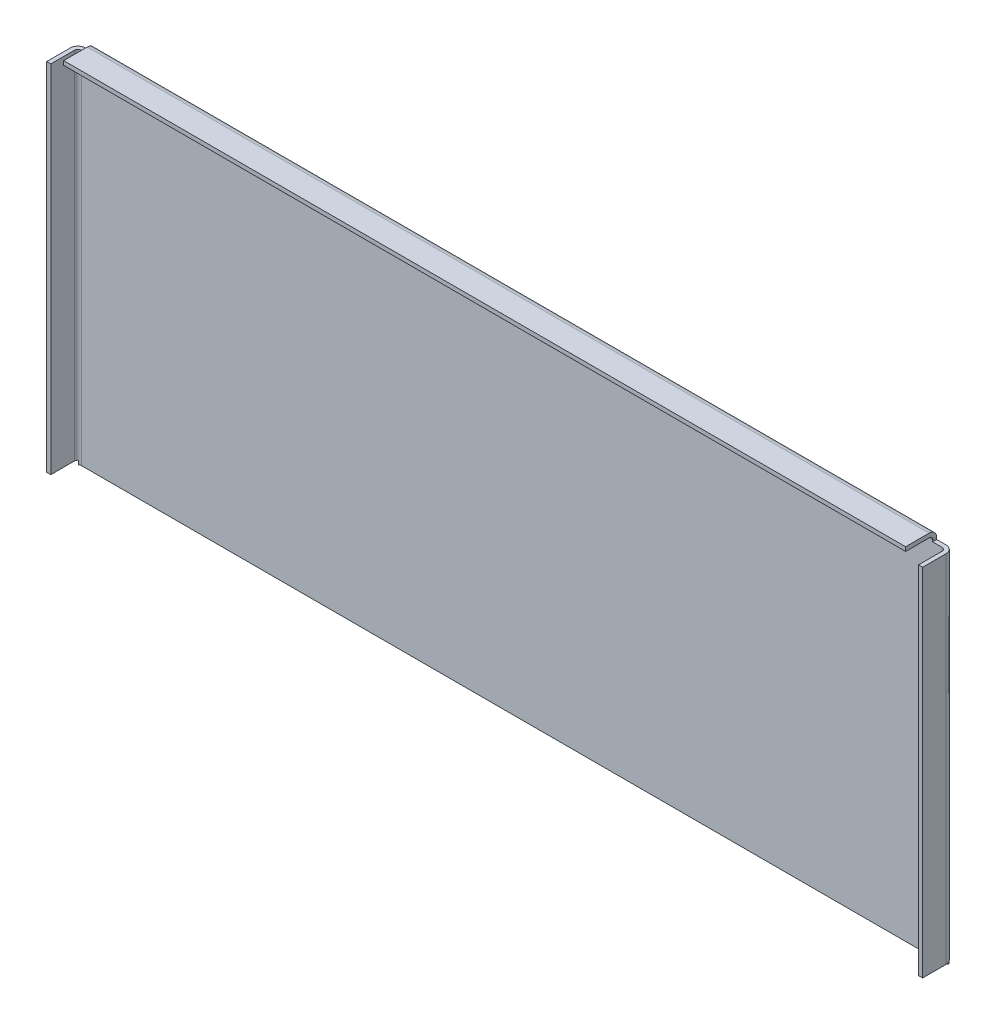
ISO-10303-21;
HEADER;
FILE_DESCRIPTION(('STEP AP214'),'2;1');
FILE_NAME('part.step','',(''),(''),'','','');
FILE_SCHEMA(('AUTOMOTIVE_DESIGN { 1 0 10303 214 1 1 1 1 }'));
ENDSEC;
DATA;
#1=APPLICATION_CONTEXT('core data for automotive mechanical design processes');
#2=APPLICATION_PROTOCOL_DEFINITION('international standard','automotive_design',2000,#1);
#3=PRODUCT_CONTEXT('',#1,'mechanical');
#4=PRODUCT('Part','Part','',(#3));
#5=PRODUCT_RELATED_PRODUCT_CATEGORY('part','',(#4));
#6=PRODUCT_DEFINITION_FORMATION('','',#4);
#7=PRODUCT_DEFINITION_CONTEXT('part definition',#1,'design');
#8=PRODUCT_DEFINITION('design','',#6,#7);
#9=PRODUCT_DEFINITION_SHAPE('','',#8);
#10=(LENGTH_UNIT() NAMED_UNIT(*) SI_UNIT(.MILLI.,.METRE.));
#11=(NAMED_UNIT(*) PLANE_ANGLE_UNIT() SI_UNIT($,.RADIAN.));
#12=(NAMED_UNIT(*) SI_UNIT($,.STERADIAN.) SOLID_ANGLE_UNIT());
#13=UNCERTAINTY_MEASURE_WITH_UNIT(LENGTH_MEASURE(1.E-05),#10,'distance_accuracy_value','');
#14=(GEOMETRIC_REPRESENTATION_CONTEXT(3) GLOBAL_UNCERTAINTY_ASSIGNED_CONTEXT((#13)) GLOBAL_UNIT_ASSIGNED_CONTEXT((#10,
#11,#12)) REPRESENTATION_CONTEXT('',''));
#15=CARTESIAN_POINT('',(0.,0.,0.));
#16=DIRECTION('',(0.,0.,1.));
#17=DIRECTION('',(1.,0.,0.));
#18=AXIS2_PLACEMENT_3D('',#15,#16,#17);
#19=CARTESIAN_POINT('',(-201.320399999998,0.,-197.706530426023));
#20=DIRECTION('',(1.,0.,0.));
#21=DIRECTION('',(0.,0.,-1.));
#22=AXIS2_PLACEMENT_3D('',#19,#20,#21);
#23=PLANE('',#22);
#24=DIRECTION('',(0.,1.,0.));
#25=VECTOR('',#24,1.);
#26=CARTESIAN_POINT('',(-201.3204,81.46415,14.2875));
#27=LINE('',#26,#25);
#28=CARTESIAN_POINT('',(-201.3204,81.46415,14.2875));
#29=VERTEX_POINT('',#28);
#30=CARTESIAN_POINT('',(-201.3204,-82.0674,14.2875));
#31=VERTEX_POINT('',#30);
#32=EDGE_CURVE('E159',#29,#31,#27,.F.);
#33=ORIENTED_EDGE('',*,*,#32,.F.);
#34=DIRECTION('',(0.,0.,1.));
#35=VECTOR('',#34,1.);
#36=CARTESIAN_POINT('',(-201.3204,81.46415,3.46709999999997));
#37=LINE('',#36,#35);
#38=CARTESIAN_POINT('',(-201.320399999999,81.46415,3.46710000000001));
#39=VERTEX_POINT('',#38);
#40=EDGE_CURVE('E256',#39,#29,#37,.T.);
#41=ORIENTED_EDGE('',*,*,#40,.F.);
#42=DIRECTION('',(0.,1.,0.));
#43=VECTOR('',#42,1.);
#44=CARTESIAN_POINT('',(-201.320399999997,-1.190625,3.46710000000002));
#45=LINE('',#44,#43);
#46=CARTESIAN_POINT('',(-201.320399999999,-82.0674,3.46710000000001));
#47=VERTEX_POINT('',#46);
#48=EDGE_CURVE('E252',#47,#39,#45,.T.);
#49=ORIENTED_EDGE('',*,*,#48,.F.);
#50=DIRECTION('',(0.,0.,1.));
#51=VECTOR('',#50,1.);
#52=CARTESIAN_POINT('',(-201.3204,-82.0674,1.58750000000001));
#53=LINE('',#52,#51);
#54=EDGE_CURVE('E275',#47,#31,#53,.T.);
#55=ORIENTED_EDGE('',*,*,#54,.T.);
#56=EDGE_LOOP('',(#33,#41,#49,#55));
#57=FACE_BOUND('',#56,.T.);
#58=ADVANCED_FACE('F17',(#57),#23,.F.);
#59=CARTESIAN_POINT('',(201.320399999998,0.,-197.706530426023));
#60=DIRECTION('',(-1.,0.,0.));
#61=DIRECTION('',(0.,0.,1.));
#62=AXIS2_PLACEMENT_3D('',#59,#60,#61);
#63=PLANE('',#62);
#64=DIRECTION('',(0.,-1.,0.));
#65=VECTOR('',#64,1.);
#66=CARTESIAN_POINT('',(201.320399999997,-1.190625,3.46710000000003));
#67=LINE('',#66,#65);
#68=CARTESIAN_POINT('',(201.320399999999,81.46415,3.46710000000003));
#69=VERTEX_POINT('',#68);
#70=CARTESIAN_POINT('',(201.320399999999,-82.0674,3.46710000000003));
#71=VERTEX_POINT('',#70);
#72=EDGE_CURVE('E347',#69,#71,#67,.T.);
#73=ORIENTED_EDGE('',*,*,#72,.F.);
#74=DIRECTION('',(0.,0.,1.));
#75=VECTOR('',#74,1.);
#76=CARTESIAN_POINT('',(201.3204,81.46415,3.46710000000005));
#77=LINE('',#76,#75);
#78=CARTESIAN_POINT('',(201.3204,81.46415,14.2875000000001));
#79=VERTEX_POINT('',#78);
#80=EDGE_CURVE('E376',#79,#69,#77,.F.);
#81=ORIENTED_EDGE('',*,*,#80,.F.);
#82=DIRECTION('',(0.,1.,0.));
#83=VECTOR('',#82,1.);
#84=CARTESIAN_POINT('',(201.3204,-83.8454,14.2875000000001));
#85=LINE('',#84,#83);
#86=CARTESIAN_POINT('',(201.3204,-82.0674,14.2875));
#87=VERTEX_POINT('',#86);
#88=EDGE_CURVE('E217',#87,#79,#85,.T.);
#89=ORIENTED_EDGE('',*,*,#88,.F.);
#90=DIRECTION('',(0.,0.,1.));
#91=VECTOR('',#90,1.);
#92=CARTESIAN_POINT('',(201.3204,-82.0674,14.2875));
#93=LINE('',#92,#91);
#94=EDGE_CURVE('E214',#87,#71,#93,.F.);
#95=ORIENTED_EDGE('',*,*,#94,.T.);
#96=EDGE_LOOP('',(#73,#81,#89,#95));
#97=FACE_BOUND('',#96,.T.);
#98=ADVANCED_FACE('F623',(#97),#63,.F.);
#99=CARTESIAN_POINT('',(0.,85.725,-82.1111304260231));
#100=DIRECTION('',(0.,-1.,0.));
#101=DIRECTION('',(0.,0.,-1.));
#102=AXIS2_PLACEMENT_3D('',#99,#100,#101);
#103=PLANE('',#102);
#104=DIRECTION('',(0.,0.,1.));
#105=VECTOR('',#104,1.);
#106=CARTESIAN_POINT('',(-193.52387,85.7249999999997,3.46709999999997));
#107=LINE('',#106,#105);
#108=CARTESIAN_POINT('',(-193.52387,85.7249999999998,14.2875));
#109=VERTEX_POINT('',#108);
#110=CARTESIAN_POINT('',(-193.52387,85.7249999999998,3.46709999999999));
#111=VERTEX_POINT('',#110);
#112=EDGE_CURVE('E288',#109,#111,#107,.F.);
#113=ORIENTED_EDGE('',*,*,#112,.F.);
#114=DIRECTION('',(1.,0.,0.));
#115=VECTOR('',#114,1.);
#116=CARTESIAN_POINT('',(193.52387,85.725,14.2875));
#117=LINE('',#116,#115);
#118=CARTESIAN_POINT('',(193.52387,85.725,14.2875));
#119=VERTEX_POINT('',#118);
#120=EDGE_CURVE('E185',#119,#109,#117,.F.);
#121=ORIENTED_EDGE('',*,*,#120,.F.);
#122=DIRECTION('',(0.,0.,1.));
#123=VECTOR('',#122,1.);
#124=CARTESIAN_POINT('',(193.52387,85.725,3.4671));
#125=LINE('',#124,#123);
#126=CARTESIAN_POINT('',(193.52387,85.725,3.4671));
#127=VERTEX_POINT('',#126);
#128=EDGE_CURVE('E294',#127,#119,#125,.T.);
#129=ORIENTED_EDGE('',*,*,#128,.F.);
#130=DIRECTION('',(1.,0.,0.));
#131=VECTOR('',#130,1.);
#132=CARTESIAN_POINT('',(0.,85.725,3.4671));
#133=LINE('',#132,#131);
#134=EDGE_CURVE('E498',#111,#127,#133,.T.);
#135=ORIENTED_EDGE('',*,*,#134,.F.);
#136=EDGE_LOOP('',(#113,#121,#129,#135));
#137=FACE_BOUND('',#136,.T.);
#138=ADVANCED_FACE('F620',(#137),#103,.F.);
#139=CARTESIAN_POINT('',(-193.52895,82.25282,1.8796));
#140=DIRECTION('',(0.,-1.,0.));
#141=DIRECTION('',(0.,0.,-1.));
#142=AXIS2_PLACEMENT_3D('',#139,#140,#141);
#143=PLANE('',#142);
#144=DIRECTION('',(0.,0.,-1.));
#145=VECTOR('',#144,1.);
#146=CARTESIAN_POINT('',(-193.52895,82.25282,0.));
#147=LINE('',#146,#145);
#148=CARTESIAN_POINT('',(-193.52895,82.25282,0.));
#149=VERTEX_POINT('',#148);
#150=CARTESIAN_POINT('',(-193.52895,82.25282,1.8796));
#151=VERTEX_POINT('',#150);
#152=EDGE_CURVE('E287',#149,#151,#147,.F.);
#153=ORIENTED_EDGE('',*,*,#152,.T.);
#154=DIRECTION('',(1.,0.,0.));
#155=VECTOR('',#154,1.);
#156=CARTESIAN_POINT('',(-193.52895,82.25282,1.8796));
#157=LINE('',#156,#155);
#158=CARTESIAN_POINT('',(-193.52387,82.25282,1.8796));
#159=VERTEX_POINT('',#158);
#160=EDGE_CURVE('E176',#159,#151,#157,.F.);
#161=ORIENTED_EDGE('',*,*,#160,.F.);
#162=DIRECTION('',(0.,0.,-1.));
#163=VECTOR('',#162,1.);
#164=CARTESIAN_POINT('',(-193.52387,82.25282,1.8796));
#165=LINE('',#164,#163);
#166=CARTESIAN_POINT('',(-193.52387,82.25282,0.));
#167=VERTEX_POINT('',#166);
#168=EDGE_CURVE('E405',#159,#167,#165,.T.);
#169=ORIENTED_EDGE('',*,*,#168,.T.);
#170=DIRECTION('',(1.,0.,0.));
#171=VECTOR('',#170,1.);
#172=CARTESIAN_POINT('',(-193.52895,82.25282,0.));
#173=LINE('',#172,#171);
#174=EDGE_CURVE('E278',#149,#167,#173,.T.);
#175=ORIENTED_EDGE('',*,*,#174,.F.);
#176=EDGE_LOOP('',(#153,#161,#169,#175));
#177=FACE_BOUND('',#176,.T.);
#178=ADVANCED_FACE('F622',(#177),#143,.F.);
#179=CARTESIAN_POINT('',(-199.4408,81.46415,14.2875));
#180=DIRECTION('',(0.,0.,1.));
#181=DIRECTION('',(1.,0.,0.));
#182=AXIS2_PLACEMENT_3D('',#179,#180,#181);
#183=PLANE('',#182);
#184=DIRECTION('',(1.,0.,0.));
#185=VECTOR('',#184,1.);
#186=CARTESIAN_POINT('',(-199.4408,81.46415,14.2875));
#187=LINE('',#186,#185);
#188=CARTESIAN_POINT('',(-199.4408,81.46415,14.2875));
#189=VERTEX_POINT('',#188);
#190=EDGE_CURVE('E259',#29,#189,#187,.T.);
#191=ORIENTED_EDGE('',*,*,#190,.F.);
#192=ORIENTED_EDGE('',*,*,#32,.T.);
#193=DIRECTION('',(1.,0.,0.));
#194=VECTOR('',#193,1.);
#195=CARTESIAN_POINT('',(-199.4408,-82.0674,14.2875));
#196=LINE('',#195,#194);
#197=CARTESIAN_POINT('',(-199.4408,-82.0674,14.2875));
#198=VERTEX_POINT('',#197);
#199=EDGE_CURVE('E272',#31,#198,#196,.T.);
#200=ORIENTED_EDGE('',*,*,#199,.T.);
#201=DIRECTION('',(0.,1.,0.));
#202=VECTOR('',#201,1.);
#203=CARTESIAN_POINT('',(-199.4408,0.,14.2875));
#204=LINE('',#203,#202);
#205=EDGE_CURVE('E266',#189,#198,#204,.F.);
#206=ORIENTED_EDGE('',*,*,#205,.F.);
#207=EDGE_LOOP('',(#191,#192,#200,#206));
#208=FACE_BOUND('',#207,.T.);
#209=ADVANCED_FACE('F629',(#208),#183,.T.);
#210=CARTESIAN_POINT('',(-201.3204,-82.0674,3.46710000000003));
#211=DIRECTION('',(0.,1.,0.));
#212=DIRECTION('',(0.,0.,1.));
#213=AXIS2_PLACEMENT_3D('',#210,#211,#212);
#214=PLANE('',#213);
#215=CARTESIAN_POINT('',(-197.8533,-82.0674,3.4671));
#216=DIRECTION('',(0.,1.,0.));
#217=DIRECTION('',(0.,0.,1.));
#218=AXIS2_PLACEMENT_3D('',#215,#216,#217);
#219=CIRCLE('',#218,3.46709999999733);
#220=CARTESIAN_POINT('',(-200.037663980923,-82.0674,0.774640825038136));
#221=VERTEX_POINT('',#220);
#222=EDGE_CURVE('E255',#221,#47,#219,.T.);
#223=ORIENTED_EDGE('',*,*,#222,.F.);
#224=DIRECTION('',(-0.630026241217164,0.,-0.776573844124158));
#225=VECTOR('',#224,1.);
#226=CARTESIAN_POINT('',(-200.037663980924,-82.0674,0.774640825037131));
#227=LINE('',#226,#225);
#228=CARTESIAN_POINT('',(-198.853466657931,-82.0674,2.23428902245493));
#229=VERTEX_POINT('',#228);
#230=EDGE_CURVE('E248',#221,#229,#227,.F.);
#231=ORIENTED_EDGE('',*,*,#230,.T.);
#232=CARTESIAN_POINT('',(-197.8533,-82.0674,3.4671));
#233=DIRECTION('',(0.,1.,0.));
#234=DIRECTION('',(0.,0.,1.));
#235=AXIS2_PLACEMENT_3D('',#232,#233,#234);
#236=CIRCLE('',#235,1.58749999999732);
#237=CARTESIAN_POINT('',(-199.440799999999,-82.0674,3.4671));
#238=VERTEX_POINT('',#237);
#239=EDGE_CURVE('E20',#238,#229,#236,.F.);
#240=ORIENTED_EDGE('',*,*,#239,.F.);
#241=DIRECTION('',(0.,0.,-1.));
#242=VECTOR('',#241,1.);
#243=CARTESIAN_POINT('',(-199.440799999998,-82.0674,-197.706530426023));
#244=LINE('',#243,#242);
#245=EDGE_CURVE('E393',#198,#238,#244,.T.);
#246=ORIENTED_EDGE('',*,*,#245,.F.);
#247=ORIENTED_EDGE('',*,*,#199,.F.);
#248=ORIENTED_EDGE('',*,*,#54,.F.);
#249=EDGE_LOOP('',(#223,#231,#240,#246,#247,#248));
#250=FACE_BOUND('',#249,.T.);
#251=ADVANCED_FACE('F636',(#250),#214,.F.);
#252=CARTESIAN_POINT('',(199.4408,-83.8454,14.2875));
#253=DIRECTION('',(0.,0.,1.));
#254=DIRECTION('',(1.,0.,0.));
#255=AXIS2_PLACEMENT_3D('',#252,#253,#254);
#256=PLANE('',#255);
#257=DIRECTION('',(1.,0.,0.));
#258=VECTOR('',#257,1.);
#259=CARTESIAN_POINT('',(199.4408,81.46415,14.2875));
#260=LINE('',#259,#258);
#261=CARTESIAN_POINT('',(199.4408,81.46415,14.2875));
#262=VERTEX_POINT('',#261);
#263=EDGE_CURVE('E223',#262,#79,#260,.T.);
#264=ORIENTED_EDGE('',*,*,#263,.F.);
#265=DIRECTION('',(0.,1.,0.));
#266=VECTOR('',#265,1.);
#267=CARTESIAN_POINT('',(199.4408,0.,14.2875));
#268=LINE('',#267,#266);
#269=CARTESIAN_POINT('',(199.4408,-82.0674,14.2875));
#270=VERTEX_POINT('',#269);
#271=EDGE_CURVE('E220',#270,#262,#268,.T.);
#272=ORIENTED_EDGE('',*,*,#271,.F.);
#273=DIRECTION('',(1.,0.,0.));
#274=VECTOR('',#273,1.);
#275=CARTESIAN_POINT('',(199.4408,-82.0674,14.2875));
#276=LINE('',#275,#274);
#277=EDGE_CURVE('E208',#270,#87,#276,.T.);
#278=ORIENTED_EDGE('',*,*,#277,.T.);
#279=ORIENTED_EDGE('',*,*,#88,.T.);
#280=EDGE_LOOP('',(#264,#272,#278,#279));
#281=FACE_BOUND('',#280,.T.);
#282=ADVANCED_FACE('F221',(#281),#256,.T.);
#283=CARTESIAN_POINT('',(199.4408,-82.0674,3.46710000000003));
#284=DIRECTION('',(0.,1.,0.));
#285=DIRECTION('',(0.,0.,1.));
#286=AXIS2_PLACEMENT_3D('',#283,#284,#285);
#287=PLANE('',#286);
#288=CARTESIAN_POINT('',(197.8533,-82.0674,3.4671));
#289=DIRECTION('',(0.,-1.,0.));
#290=DIRECTION('',(0.,0.,-1.));
#291=AXIS2_PLACEMENT_3D('',#288,#289,#290);
#292=CIRCLE('',#291,1.58749999999732);
#293=CARTESIAN_POINT('',(198.853466657931,-82.0674,2.23428902245493));
#294=VERTEX_POINT('',#293);
#295=CARTESIAN_POINT('',(199.440799999999,-82.0674,3.46710000000002));
#296=VERTEX_POINT('',#295);
#297=EDGE_CURVE('E299',#294,#296,#292,.T.);
#298=ORIENTED_EDGE('',*,*,#297,.F.);
#299=DIRECTION('',(-0.630026241217164,0.,0.776573844124158));
#300=VECTOR('',#299,1.);
#301=CARTESIAN_POINT('',(200.037663980924,-82.0674,0.774640825037131));
#302=LINE('',#301,#300);
#303=CARTESIAN_POINT('',(200.037663980923,-82.0674,0.774640825038136));
#304=VERTEX_POINT('',#303);
#305=EDGE_CURVE('E362',#294,#304,#302,.F.);
#306=ORIENTED_EDGE('',*,*,#305,.T.);
#307=CARTESIAN_POINT('',(197.8533,-82.0674,3.4671));
#308=DIRECTION('',(0.,-1.,0.));
#309=DIRECTION('',(0.,0.,-1.));
#310=AXIS2_PLACEMENT_3D('',#307,#308,#309);
#311=CIRCLE('',#310,3.46709999999733);
#312=EDGE_CURVE('E343',#71,#304,#311,.F.);
#313=ORIENTED_EDGE('',*,*,#312,.F.);
#314=ORIENTED_EDGE('',*,*,#94,.F.);
#315=ORIENTED_EDGE('',*,*,#277,.F.);
#316=DIRECTION('',(0.,0.,1.));
#317=VECTOR('',#316,1.);
#318=CARTESIAN_POINT('',(199.440799999998,-82.0674,-197.706530426023));
#319=LINE('',#318,#317);
#320=EDGE_CURVE('E212',#296,#270,#319,.T.);
#321=ORIENTED_EDGE('',*,*,#320,.F.);
#322=EDGE_LOOP('',(#298,#306,#313,#314,#315,#321));
#323=FACE_BOUND('',#322,.T.);
#324=ADVANCED_FACE('F210',(#323),#287,.F.);
#325=CARTESIAN_POINT('',(193.52387,82.25282,1.8796));
#326=DIRECTION('',(0.,-1.,0.));
#327=DIRECTION('',(0.,0.,-1.));
#328=AXIS2_PLACEMENT_3D('',#325,#326,#327);
#329=PLANE('',#328);
#330=DIRECTION('',(0.,0.,1.));
#331=VECTOR('',#330,1.);
#332=CARTESIAN_POINT('',(193.52387,82.25282,1.8796));
#333=LINE('',#332,#331);
#334=CARTESIAN_POINT('',(193.52387,82.25282,0.));
#335=VERTEX_POINT('',#334);
#336=CARTESIAN_POINT('',(193.52387,82.25282,1.8796));
#337=VERTEX_POINT('',#336);
#338=EDGE_CURVE('E346',#335,#337,#333,.T.);
#339=ORIENTED_EDGE('',*,*,#338,.T.);
#340=DIRECTION('',(1.,0.,0.));
#341=VECTOR('',#340,1.);
#342=CARTESIAN_POINT('',(193.52387,82.25282,1.8796));
#343=LINE('',#342,#341);
#344=CARTESIAN_POINT('',(193.52895,82.25282,1.8796));
#345=VERTEX_POINT('',#344);
#346=EDGE_CURVE('E350',#345,#337,#343,.F.);
#347=ORIENTED_EDGE('',*,*,#346,.F.);
#348=DIRECTION('',(0.,0.,1.));
#349=VECTOR('',#348,1.);
#350=CARTESIAN_POINT('',(193.52895,82.25282,0.));
#351=LINE('',#350,#349);
#352=CARTESIAN_POINT('',(193.52895,82.25282,0.));
#353=VERTEX_POINT('',#352);
#354=EDGE_CURVE('E418',#345,#353,#351,.F.);
#355=ORIENTED_EDGE('',*,*,#354,.T.);
#356=DIRECTION('',(1.,0.,0.));
#357=VECTOR('',#356,1.);
#358=CARTESIAN_POINT('',(193.52387,82.25282,0.));
#359=LINE('',#358,#357);
#360=EDGE_CURVE('E349',#335,#353,#359,.T.);
#361=ORIENTED_EDGE('',*,*,#360,.F.);
#362=EDGE_LOOP('',(#339,#347,#355,#361));
#363=FACE_BOUND('',#362,.T.);
#364=ADVANCED_FACE('F645',(#363),#329,.F.);
#365=CARTESIAN_POINT('',(-197.8533,-1.190625,3.4671));
#366=DIRECTION('',(0.,1.,0.));
#367=DIRECTION('',(0.,0.,1.));
#368=AXIS2_PLACEMENT_3D('',#365,#366,#367);
#369=CYLINDRICAL_SURFACE('',#368,3.46709999999733);
#370=DIRECTION('',(0.,1.,0.));
#371=VECTOR('',#370,1.);
#372=CARTESIAN_POINT('',(-197.8533,0.,0.));
#373=LINE('',#372,#371);
#374=CARTESIAN_POINT('',(-197.8533,81.46415,1.33356867215717E-12));
#375=VERTEX_POINT('',#374);
#376=CARTESIAN_POINT('',(-197.8533,-83.8454,1.33315233852294E-12));
#377=VERTEX_POINT('',#376);
#378=EDGE_CURVE('E421',#375,#377,#373,.F.);
#379=ORIENTED_EDGE('',*,*,#378,.T.);
#380=CARTESIAN_POINT('',(-197.8533,-83.8454,3.4671));
#381=DIRECTION('',(0.,1.,0.));
#382=DIRECTION('',(0.,0.,1.));
#383=AXIS2_PLACEMENT_3D('',#380,#381,#382);
#384=CIRCLE('',#383,3.46709999999733);
#385=CARTESIAN_POINT('',(-200.037663980923,-83.8454,0.77464082503813));
#386=VERTEX_POINT('',#385);
#387=EDGE_CURVE('E234',#386,#377,#384,.F.);
#388=ORIENTED_EDGE('',*,*,#387,.F.);
#389=DIRECTION('',(0.,1.,0.));
#390=VECTOR('',#389,1.);
#391=CARTESIAN_POINT('',(-200.037663980924,-83.8454,0.774640825037123));
#392=LINE('',#391,#390);
#393=EDGE_CURVE('E244',#386,#221,#392,.T.);
#394=ORIENTED_EDGE('',*,*,#393,.T.);
#395=ORIENTED_EDGE('',*,*,#222,.T.);
#396=ORIENTED_EDGE('',*,*,#48,.T.);
#397=CARTESIAN_POINT('',(-197.8533,81.46415,3.4671));
#398=DIRECTION('',(0.,1.,0.));
#399=DIRECTION('',(0.,0.,1.));
#400=AXIS2_PLACEMENT_3D('',#397,#398,#399);
#401=CIRCLE('',#400,3.46709999999733);
#402=EDGE_CURVE('E251',#375,#39,#401,.T.);
#403=ORIENTED_EDGE('',*,*,#402,.F.);
#404=EDGE_LOOP('',(#379,#388,#394,#395,#396,#403));
#405=FACE_BOUND('',#404,.T.);
#406=ADVANCED_FACE('F571',(#405),#369,.T.);
#407=CARTESIAN_POINT('',(197.8533,-1.190625,3.4671));
#408=DIRECTION('',(0.,-1.,0.));
#409=DIRECTION('',(0.,0.,-1.));
#410=AXIS2_PLACEMENT_3D('',#407,#408,#409);
#411=CYLINDRICAL_SURFACE('',#410,3.46709999999733);
#412=ORIENTED_EDGE('',*,*,#72,.T.);
#413=ORIENTED_EDGE('',*,*,#312,.T.);
#414=DIRECTION('',(0.,1.,0.));
#415=VECTOR('',#414,1.);
#416=CARTESIAN_POINT('',(200.037663980924,-82.0674,0.774640825037123));
#417=LINE('',#416,#415);
#418=CARTESIAN_POINT('',(200.037663980923,-83.8454,0.774640825038136));
#419=VERTEX_POINT('',#418);
#420=EDGE_CURVE('E364',#304,#419,#417,.F.);
#421=ORIENTED_EDGE('',*,*,#420,.T.);
#422=CARTESIAN_POINT('',(197.8533,-83.8454,3.4671));
#423=DIRECTION('',(0.,-1.,0.));
#424=DIRECTION('',(0.,0.,-1.));
#425=AXIS2_PLACEMENT_3D('',#422,#423,#424);
#426=CIRCLE('',#425,3.46709999999733);
#427=CARTESIAN_POINT('',(197.8533,-83.8454,1.33313499128818E-12));
#428=VERTEX_POINT('',#427);
#429=EDGE_CURVE('E338',#428,#419,#426,.T.);
#430=ORIENTED_EDGE('',*,*,#429,.F.);
#431=DIRECTION('',(0.,1.,0.));
#432=VECTOR('',#431,1.);
#433=CARTESIAN_POINT('',(197.8533,0.,0.));
#434=LINE('',#433,#432);
#435=CARTESIAN_POINT('',(197.8533,81.46415,1.33356867215717E-12));
#436=VERTEX_POINT('',#435);
#437=EDGE_CURVE('E426',#428,#436,#434,.T.);
#438=ORIENTED_EDGE('',*,*,#437,.T.);
#439=CARTESIAN_POINT('',(197.8533,81.46415,3.4671));
#440=DIRECTION('',(0.,-1.,0.));
#441=DIRECTION('',(0.,0.,-1.));
#442=AXIS2_PLACEMENT_3D('',#439,#440,#441);
#443=CIRCLE('',#442,3.46709999999733);
#444=EDGE_CURVE('E334',#69,#436,#443,.F.);
#445=ORIENTED_EDGE('',*,*,#444,.F.);
#446=EDGE_LOOP('',(#412,#413,#421,#430,#438,#445));
#447=FACE_BOUND('',#446,.T.);
#448=ADVANCED_FACE('F563',(#447),#411,.T.);
#449=CARTESIAN_POINT('',(0.,82.2579,3.4671));
#450=DIRECTION('',(1.,0.,0.));
#451=DIRECTION('',(0.,1.,0.));
#452=AXIS2_PLACEMENT_3D('',#449,#450,#451);
#453=CYLINDRICAL_SURFACE('',#452,3.4671);
#454=DIRECTION('',(1.,0.,0.));
#455=VECTOR('',#454,1.);
#456=CARTESIAN_POINT('',(0.,82.2579,0.));
#457=LINE('',#456,#455);
#458=CARTESIAN_POINT('',(193.52387,82.2579,0.));
#459=VERTEX_POINT('',#458);
#460=CARTESIAN_POINT('',(-193.52387,82.2579,0.));
#461=VERTEX_POINT('',#460);
#462=EDGE_CURVE('E396',#459,#461,#457,.F.);
#463=ORIENTED_EDGE('',*,*,#462,.T.);
#464=CARTESIAN_POINT('',(-193.52387,82.2578999999999,3.4671));
#465=DIRECTION('',(1.,0.,0.));
#466=DIRECTION('',(0.,1.,0.));
#467=AXIS2_PLACEMENT_3D('',#464,#465,#466);
#468=CIRCLE('',#467,3.4671);
#469=EDGE_CURVE('E327',#111,#461,#468,.F.);
#470=ORIENTED_EDGE('',*,*,#469,.F.);
#471=ORIENTED_EDGE('',*,*,#134,.T.);
#472=CARTESIAN_POINT('',(193.52387,82.2579,3.4671));
#473=DIRECTION('',(1.,0.,0.));
#474=DIRECTION('',(0.,1.,0.));
#475=AXIS2_PLACEMENT_3D('',#472,#473,#474);
#476=CIRCLE('',#475,3.4671);
#477=EDGE_CURVE('E331',#459,#127,#476,.T.);
#478=ORIENTED_EDGE('',*,*,#477,.F.);
#479=EDGE_LOOP('',(#463,#470,#471,#478));
#480=FACE_BOUND('',#479,.T.);
#481=ADVANCED_FACE('F618',(#480),#453,.T.);
#482=CARTESIAN_POINT('',(193.52387,83.8454,14.2875));
#483=DIRECTION('',(0.,0.,1.));
#484=DIRECTION('',(0.,-1.,0.));
#485=AXIS2_PLACEMENT_3D('',#482,#483,#484);
#486=PLANE('',#485);
#487=DIRECTION('',(1.,0.,0.));
#488=VECTOR('',#487,1.);
#489=CARTESIAN_POINT('',(0.,83.8453999999999,14.2875));
#490=LINE('',#489,#488);
#491=CARTESIAN_POINT('',(193.52387,83.8454,14.2875));
#492=VERTEX_POINT('',#491);
#493=CARTESIAN_POINT('',(-193.52387,83.8453999999999,14.2875));
#494=VERTEX_POINT('',#493);
#495=EDGE_CURVE('E488',#492,#494,#490,.F.);
#496=ORIENTED_EDGE('',*,*,#495,.F.);
#497=DIRECTION('',(0.,-1.,0.));
#498=VECTOR('',#497,1.);
#499=CARTESIAN_POINT('',(193.52387,83.8454,14.2875));
#500=LINE('',#499,#498);
#501=EDGE_CURVE('E293',#492,#119,#500,.F.);
#502=ORIENTED_EDGE('',*,*,#501,.T.);
#503=ORIENTED_EDGE('',*,*,#120,.T.);
#504=DIRECTION('',(0.,-1.,0.));
#505=VECTOR('',#504,1.);
#506=CARTESIAN_POINT('',(-193.52387,83.8454,14.2875));
#507=LINE('',#506,#505);
#508=EDGE_CURVE('E483',#494,#109,#507,.F.);
#509=ORIENTED_EDGE('',*,*,#508,.F.);
#510=EDGE_LOOP('',(#496,#502,#503,#509));
#511=FACE_BOUND('',#510,.T.);
#512=ADVANCED_FACE('F519',(#511),#486,.T.);
#513=CARTESIAN_POINT('',(-193.52895,81.46415,0.));
#514=DIRECTION('',(1.,0.,0.));
#515=DIRECTION('',(0.,0.,-1.));
#516=AXIS2_PLACEMENT_3D('',#513,#514,#515);
#517=PLANE('',#516);
#518=DIRECTION('',(0.,1.,0.));
#519=VECTOR('',#518,1.);
#520=CARTESIAN_POINT('',(-193.52895,0.,0.));
#521=LINE('',#520,#519);
#522=CARTESIAN_POINT('',(-193.52895,81.46415,0.));
#523=VERTEX_POINT('',#522);
#524=EDGE_CURVE('E336',#149,#523,#521,.F.);
#525=ORIENTED_EDGE('',*,*,#524,.T.);
#526=DIRECTION('',(0.,0.,-1.));
#527=VECTOR('',#526,1.);
#528=CARTESIAN_POINT('',(-193.52895,81.46415,1.8796));
#529=LINE('',#528,#527);
#530=CARTESIAN_POINT('',(-193.52895,81.46415,1.8796));
#531=VERTEX_POINT('',#530);
#532=EDGE_CURVE('E457',#523,#531,#529,.F.);
#533=ORIENTED_EDGE('',*,*,#532,.T.);
#534=DIRECTION('',(0.,1.,0.));
#535=VECTOR('',#534,1.);
#536=CARTESIAN_POINT('',(-193.52895,81.46415,1.8796));
#537=LINE('',#536,#535);
#538=EDGE_CURVE('E285',#151,#531,#537,.F.);
#539=ORIENTED_EDGE('',*,*,#538,.F.);
#540=ORIENTED_EDGE('',*,*,#152,.F.);
#541=EDGE_LOOP('',(#525,#533,#539,#540));
#542=FACE_BOUND('',#541,.T.);
#543=ADVANCED_FACE('F581',(#542),#517,.F.);
#544=CARTESIAN_POINT('',(-199.440799999998,0.,-197.706530426023));
#545=DIRECTION('',(1.,0.,0.));
#546=DIRECTION('',(0.,0.,-1.));
#547=AXIS2_PLACEMENT_3D('',#544,#545,#546);
#548=PLANE('',#547);
#549=DIRECTION('',(0.,0.,-1.));
#550=VECTOR('',#549,1.);
#551=CARTESIAN_POINT('',(-199.440799999998,81.46415,-197.706530426023));
#552=LINE('',#551,#550);
#553=CARTESIAN_POINT('',(-199.440799999999,81.46415,3.4671));
#554=VERTEX_POINT('',#553);
#555=EDGE_CURVE('E269',#554,#189,#552,.F.);
#556=ORIENTED_EDGE('',*,*,#555,.T.);
#557=ORIENTED_EDGE('',*,*,#205,.T.);
#558=ORIENTED_EDGE('',*,*,#245,.T.);
#559=DIRECTION('',(0.,1.,0.));
#560=VECTOR('',#559,1.);
#561=CARTESIAN_POINT('',(-199.440799999997,-1.190625,3.46709999999997));
#562=LINE('',#561,#560);
#563=EDGE_CURVE('E149',#238,#554,#562,.T.);
#564=ORIENTED_EDGE('',*,*,#563,.T.);
#565=EDGE_LOOP('',(#556,#557,#558,#564));
#566=FACE_BOUND('',#565,.T.);
#567=ADVANCED_FACE('F658',(#566),#548,.T.);
#568=CARTESIAN_POINT('',(-200.037663980924,-83.8454,0.774640825037131));
#569=DIRECTION('',(0.776573844124158,0.,-0.630026241217164));
#570=DIRECTION('',(-0.630026241217164,0.,-0.776573844124158));
#571=AXIS2_PLACEMENT_3D('',#568,#569,#570);
#572=PLANE('',#571);
#573=DIRECTION('',(-0.630026241217156,0.,-0.776573844124165));
#574=VECTOR('',#573,1.);
#575=CARTESIAN_POINT('',(-198.853466657932,-83.8454,2.23428902245289));
#576=LINE('',#575,#574);
#577=CARTESIAN_POINT('',(-198.853466657931,-83.8454,2.23428902245493));
#578=VERTEX_POINT('',#577);
#579=EDGE_CURVE('E237',#578,#386,#576,.T.);
#580=ORIENTED_EDGE('',*,*,#579,.F.);
#581=DIRECTION('',(0.,1.,0.));
#582=VECTOR('',#581,1.);
#583=CARTESIAN_POINT('',(-198.853466657931,-1.190625,2.23428902245493));
#584=LINE('',#583,#582);
#585=EDGE_CURVE('E324',#578,#229,#584,.T.);
#586=ORIENTED_EDGE('',*,*,#585,.T.);
#587=ORIENTED_EDGE('',*,*,#230,.F.);
#588=ORIENTED_EDGE('',*,*,#393,.F.);
#589=EDGE_LOOP('',(#580,#586,#587,#588));
#590=FACE_BOUND('',#589,.T.);
#591=ADVANCED_FACE('F661',(#590),#572,.F.);
#592=CARTESIAN_POINT('',(199.440799999998,0.,-197.706530426023));
#593=DIRECTION('',(-1.,0.,0.));
#594=DIRECTION('',(0.,0.,1.));
#595=AXIS2_PLACEMENT_3D('',#592,#593,#594);
#596=PLANE('',#595);
#597=DIRECTION('',(0.,0.,1.));
#598=VECTOR('',#597,1.);
#599=CARTESIAN_POINT('',(199.440799999998,81.46415,-197.706530426023));
#600=LINE('',#599,#598);
#601=CARTESIAN_POINT('',(199.440799999999,81.46415,3.46710000000002));
#602=VERTEX_POINT('',#601);
#603=EDGE_CURVE('E228',#262,#602,#600,.F.);
#604=ORIENTED_EDGE('',*,*,#603,.T.);
#605=DIRECTION('',(0.,-1.,0.));
#606=VECTOR('',#605,1.);
#607=CARTESIAN_POINT('',(199.440799999997,-1.190625,3.46710000000005));
#608=LINE('',#607,#606);
#609=EDGE_CURVE('E233',#602,#296,#608,.T.);
#610=ORIENTED_EDGE('',*,*,#609,.T.);
#611=ORIENTED_EDGE('',*,*,#320,.T.);
#612=ORIENTED_EDGE('',*,*,#271,.T.);
#613=EDGE_LOOP('',(#604,#610,#611,#612));
#614=FACE_BOUND('',#613,.T.);
#615=ADVANCED_FACE('F231',(#614),#596,.T.);
#616=CARTESIAN_POINT('',(200.037663980924,-82.0674,0.774640825037131));
#617=DIRECTION('',(-0.776573844124158,0.,-0.630026241217164));
#618=DIRECTION('',(-0.630026241217164,0.,0.776573844124158));
#619=AXIS2_PLACEMENT_3D('',#616,#617,#618);
#620=PLANE('',#619);
#621=ORIENTED_EDGE('',*,*,#305,.F.);
#622=DIRECTION('',(0.,-1.,0.));
#623=VECTOR('',#622,1.);
#624=CARTESIAN_POINT('',(198.853466657931,-1.190625,2.23428902245493));
#625=LINE('',#624,#623);
#626=CARTESIAN_POINT('',(198.853466657931,-83.8454,2.23428902245493));
#627=VERTEX_POINT('',#626);
#628=EDGE_CURVE('E366',#294,#627,#625,.T.);
#629=ORIENTED_EDGE('',*,*,#628,.T.);
#630=DIRECTION('',(-0.630026241217164,0.,0.776573844124158));
#631=VECTOR('',#630,1.);
#632=CARTESIAN_POINT('',(200.037663980924,-83.8454,0.774640825037131));
#633=LINE('',#632,#631);
#634=EDGE_CURVE('E365',#419,#627,#633,.T.);
#635=ORIENTED_EDGE('',*,*,#634,.F.);
#636=ORIENTED_EDGE('',*,*,#420,.F.);
#637=EDGE_LOOP('',(#621,#629,#635,#636));
#638=FACE_BOUND('',#637,.T.);
#639=ADVANCED_FACE('F668',(#638),#620,.F.);
#640=CARTESIAN_POINT('',(193.52895,83.8454,0.));
#641=DIRECTION('',(-1.,0.,0.));
#642=DIRECTION('',(0.,0.,1.));
#643=AXIS2_PLACEMENT_3D('',#640,#641,#642);
#644=PLANE('',#643);
#645=DIRECTION('',(0.,1.,0.));
#646=VECTOR('',#645,1.);
#647=CARTESIAN_POINT('',(193.52895,83.8454,1.8796));
#648=LINE('',#647,#646);
#649=CARTESIAN_POINT('',(193.52895,81.46415,1.8796));
#650=VERTEX_POINT('',#649);
#651=EDGE_CURVE('E372',#650,#345,#648,.T.);
#652=ORIENTED_EDGE('',*,*,#651,.F.);
#653=DIRECTION('',(0.,0.,-1.));
#654=VECTOR('',#653,1.);
#655=CARTESIAN_POINT('',(193.52895,81.46415,1.8796));
#656=LINE('',#655,#654);
#657=CARTESIAN_POINT('',(193.52895,81.46415,0.));
#658=VERTEX_POINT('',#657);
#659=EDGE_CURVE('E369',#650,#658,#656,.T.);
#660=ORIENTED_EDGE('',*,*,#659,.T.);
#661=DIRECTION('',(0.,1.,0.));
#662=VECTOR('',#661,1.);
#663=CARTESIAN_POINT('',(193.52895,0.,0.));
#664=LINE('',#663,#662);
#665=EDGE_CURVE('E411',#658,#353,#664,.T.);
#666=ORIENTED_EDGE('',*,*,#665,.T.);
#667=ORIENTED_EDGE('',*,*,#354,.F.);
#668=EDGE_LOOP('',(#652,#660,#666,#667));
#669=FACE_BOUND('',#668,.T.);
#670=ADVANCED_FACE('F552',(#669),#644,.F.);
#671=CARTESIAN_POINT('',(0.,0.,0.));
#672=DIRECTION('',(0.,0.,1.));
#673=DIRECTION('',(1.,0.,0.));
#674=AXIS2_PLACEMENT_3D('',#671,#672,#673);
#675=PLANE('',#674);
#676=ORIENTED_EDGE('',*,*,#524,.F.);
#677=ORIENTED_EDGE('',*,*,#174,.T.);
#678=DIRECTION('',(0.,1.,0.));
#679=VECTOR('',#678,1.);
#680=CARTESIAN_POINT('',(-193.52387,0.,0.));
#681=LINE('',#680,#679);
#682=EDGE_CURVE('E399',#461,#167,#681,.F.);
#683=ORIENTED_EDGE('',*,*,#682,.F.);
#684=ORIENTED_EDGE('',*,*,#462,.F.);
#685=DIRECTION('',(0.,1.,0.));
#686=VECTOR('',#685,1.);
#687=CARTESIAN_POINT('',(193.52387,0.,0.));
#688=LINE('',#687,#686);
#689=EDGE_CURVE('E400',#335,#459,#688,.T.);
#690=ORIENTED_EDGE('',*,*,#689,.F.);
#691=ORIENTED_EDGE('',*,*,#360,.T.);
#692=ORIENTED_EDGE('',*,*,#665,.F.);
#693=DIRECTION('',(1.,0.,0.));
#694=VECTOR('',#693,1.);
#695=CARTESIAN_POINT('',(197.84822,81.46415,0.));
#696=LINE('',#695,#694);
#697=EDGE_CURVE('E317',#658,#436,#696,.T.);
#698=ORIENTED_EDGE('',*,*,#697,.T.);
#699=ORIENTED_EDGE('',*,*,#437,.F.);
#700=DIRECTION('',(1.,0.,0.));
#701=VECTOR('',#700,1.);
#702=CARTESIAN_POINT('',(199.4408,-83.8454,0.));
#703=LINE('',#702,#701);
#704=EDGE_CURVE('E320',#377,#428,#703,.T.);
#705=ORIENTED_EDGE('',*,*,#704,.F.);
#706=ORIENTED_EDGE('',*,*,#378,.F.);
#707=DIRECTION('',(1.,0.,0.));
#708=VECTOR('',#707,1.);
#709=CARTESIAN_POINT('',(-199.4408,81.46415,0.));
#710=LINE('',#709,#708);
#711=EDGE_CURVE('E469',#375,#523,#710,.T.);
#712=ORIENTED_EDGE('',*,*,#711,.T.);
#713=EDGE_LOOP('',(#676,#677,#683,#684,#690,#691,#692,#698,#699,#705,#706,#712));
#714=FACE_BOUND('',#713,.T.);
#715=ADVANCED_FACE('F558',(#714),#675,.F.);
#716=CARTESIAN_POINT('',(193.52387,83.8454,3.4671));
#717=DIRECTION('',(1.,0.,0.));
#718=DIRECTION('',(0.,1.,0.));
#719=AXIS2_PLACEMENT_3D('',#716,#717,#718);
#720=PLANE('',#719);
#721=CARTESIAN_POINT('',(193.52387,82.2579,3.4671));
#722=DIRECTION('',(1.,0.,0.));
#723=DIRECTION('',(0.,1.,0.));
#724=AXIS2_PLACEMENT_3D('',#721,#722,#723);
#725=CIRCLE('',#724,1.5875);
#726=CARTESIAN_POINT('',(193.52387,83.8454,3.4671));
#727=VERTEX_POINT('',#726);
#728=CARTESIAN_POINT('',(193.52387,82.2579,1.8796));
#729=VERTEX_POINT('',#728);
#730=EDGE_CURVE('E314',#727,#729,#725,.F.);
#731=ORIENTED_EDGE('',*,*,#730,.T.);
#732=DIRECTION('',(0.,1.,0.));
#733=VECTOR('',#732,1.);
#734=CARTESIAN_POINT('',(193.52387,83.8454,1.8796));
#735=LINE('',#734,#733);
#736=EDGE_CURVE('E415',#337,#729,#735,.T.);
#737=ORIENTED_EDGE('',*,*,#736,.F.);
#738=ORIENTED_EDGE('',*,*,#338,.F.);
#739=ORIENTED_EDGE('',*,*,#689,.T.);
#740=ORIENTED_EDGE('',*,*,#477,.T.);
#741=ORIENTED_EDGE('',*,*,#128,.T.);
#742=ORIENTED_EDGE('',*,*,#501,.F.);
#743=DIRECTION('',(0.,0.,-1.));
#744=VECTOR('',#743,1.);
#745=CARTESIAN_POINT('',(193.52387,83.8454000000001,-82.1111304260231));
#746=LINE('',#745,#744);
#747=EDGE_CURVE('E330',#727,#492,#746,.F.);
#748=ORIENTED_EDGE('',*,*,#747,.F.);
#749=EDGE_LOOP('',(#731,#737,#738,#739,#740,#741,#742,#748));
#750=FACE_BOUND('',#749,.T.);
#751=ADVANCED_FACE('F515',(#750),#720,.T.);
#752=CARTESIAN_POINT('',(-193.52387,85.725,3.4671));
#753=DIRECTION('',(-1.,0.,0.));
#754=DIRECTION('',(0.,-1.,0.));
#755=AXIS2_PLACEMENT_3D('',#752,#753,#754);
#756=PLANE('',#755);
#757=ORIENTED_EDGE('',*,*,#469,.T.);
#758=ORIENTED_EDGE('',*,*,#682,.T.);
#759=ORIENTED_EDGE('',*,*,#168,.F.);
#760=DIRECTION('',(0.,1.,0.));
#761=VECTOR('',#760,1.);
#762=CARTESIAN_POINT('',(-193.52387,82.25282,1.8796));
#763=LINE('',#762,#761);
#764=CARTESIAN_POINT('',(-193.52387,82.2579,1.8796));
#765=VERTEX_POINT('',#764);
#766=EDGE_CURVE('E36',#765,#159,#763,.F.);
#767=ORIENTED_EDGE('',*,*,#766,.F.);
#768=CARTESIAN_POINT('',(-193.52387,82.2578999999999,3.4671));
#769=DIRECTION('',(1.,0.,0.));
#770=DIRECTION('',(0.,1.,0.));
#771=AXIS2_PLACEMENT_3D('',#768,#769,#770);
#772=CIRCLE('',#771,1.5875);
#773=CARTESIAN_POINT('',(-193.52387,83.8453999999999,3.46709999999999));
#774=VERTEX_POINT('',#773);
#775=EDGE_CURVE('E311',#765,#774,#772,.T.);
#776=ORIENTED_EDGE('',*,*,#775,.T.);
#777=DIRECTION('',(0.,0.,-1.));
#778=VECTOR('',#777,1.);
#779=CARTESIAN_POINT('',(-193.52387,83.8453999999999,-82.1111304260231));
#780=LINE('',#779,#778);
#781=EDGE_CURVE('E472',#494,#774,#780,.T.);
#782=ORIENTED_EDGE('',*,*,#781,.F.);
#783=ORIENTED_EDGE('',*,*,#508,.T.);
#784=ORIENTED_EDGE('',*,*,#112,.T.);
#785=EDGE_LOOP('',(#757,#758,#759,#767,#776,#782,#783,#784));
#786=FACE_BOUND('',#785,.T.);
#787=ADVANCED_FACE('F619',(#786),#756,.T.);
#788=CARTESIAN_POINT('',(0.,83.8454,-82.1111304260231));
#789=DIRECTION('',(0.,-1.,0.));
#790=DIRECTION('',(0.,0.,-1.));
#791=AXIS2_PLACEMENT_3D('',#788,#789,#790);
#792=PLANE('',#791);
#793=ORIENTED_EDGE('',*,*,#495,.T.);
#794=ORIENTED_EDGE('',*,*,#781,.T.);
#795=DIRECTION('',(1.,0.,0.));
#796=VECTOR('',#795,1.);
#797=CARTESIAN_POINT('',(0.,83.8454,3.4671));
#798=LINE('',#797,#796);
#799=EDGE_CURVE('E313',#774,#727,#798,.T.);
#800=ORIENTED_EDGE('',*,*,#799,.T.);
#801=ORIENTED_EDGE('',*,*,#747,.T.);
#802=EDGE_LOOP('',(#793,#794,#800,#801));
#803=FACE_BOUND('',#802,.T.);
#804=ADVANCED_FACE('F525',(#803),#792,.T.);
#805=CARTESIAN_POINT('',(-199.4408,81.46415,1.8796));
#806=DIRECTION('',(0.,-1.,0.));
#807=DIRECTION('',(0.,0.,-1.));
#808=AXIS2_PLACEMENT_3D('',#805,#806,#807);
#809=PLANE('',#808);
#810=DIRECTION('',(1.,0.,0.));
#811=VECTOR('',#810,1.);
#812=CARTESIAN_POINT('',(0.,81.46415,1.8796));
#813=LINE('',#812,#811);
#814=CARTESIAN_POINT('',(-197.8533,81.46415,1.87960000000134));
#815=VERTEX_POINT('',#814);
#816=EDGE_CURVE('E451',#531,#815,#813,.F.);
#817=ORIENTED_EDGE('',*,*,#816,.F.);
#818=ORIENTED_EDGE('',*,*,#532,.F.);
#819=ORIENTED_EDGE('',*,*,#711,.F.);
#820=ORIENTED_EDGE('',*,*,#402,.T.);
#821=ORIENTED_EDGE('',*,*,#40,.T.);
#822=ORIENTED_EDGE('',*,*,#190,.T.);
#823=ORIENTED_EDGE('',*,*,#555,.F.);
#824=CARTESIAN_POINT('',(-197.8533,81.46415,3.4671));
#825=DIRECTION('',(0.,1.,0.));
#826=DIRECTION('',(0.,0.,1.));
#827=AXIS2_PLACEMENT_3D('',#824,#825,#826);
#828=CIRCLE('',#827,1.58749999999732);
#829=EDGE_CURVE('E325',#554,#815,#828,.F.);
#830=ORIENTED_EDGE('',*,*,#829,.T.);
#831=EDGE_LOOP('',(#817,#818,#819,#820,#821,#822,#823,#830));
#832=FACE_BOUND('',#831,.T.);
#833=ADVANCED_FACE('F577',(#832),#809,.F.);
#834=CARTESIAN_POINT('',(-197.8533,-1.190625,3.4671));
#835=DIRECTION('',(0.,1.,0.));
#836=DIRECTION('',(0.,0.,1.));
#837=AXIS2_PLACEMENT_3D('',#834,#835,#836);
#838=CYLINDRICAL_SURFACE('',#837,1.58749999999732);
#839=ORIENTED_EDGE('',*,*,#585,.F.);
#840=CARTESIAN_POINT('',(-197.8533,-83.8454,3.4671));
#841=DIRECTION('',(0.,1.,0.));
#842=DIRECTION('',(0.,0.,1.));
#843=AXIS2_PLACEMENT_3D('',#840,#841,#842);
#844=CIRCLE('',#843,1.58749999999732);
#845=CARTESIAN_POINT('',(-197.8533,-83.8454,1.87960000000134));
#846=VERTEX_POINT('',#845);
#847=EDGE_CURVE('E321',#846,#578,#844,.T.);
#848=ORIENTED_EDGE('',*,*,#847,.F.);
#849=DIRECTION('',(0.,1.,0.));
#850=VECTOR('',#849,1.);
#851=CARTESIAN_POINT('',(-197.8533,0.,1.8796));
#852=LINE('',#851,#850);
#853=EDGE_CURVE('E448',#815,#846,#852,.F.);
#854=ORIENTED_EDGE('',*,*,#853,.F.);
#855=ORIENTED_EDGE('',*,*,#829,.F.);
#856=ORIENTED_EDGE('',*,*,#563,.F.);
#857=ORIENTED_EDGE('',*,*,#239,.T.);
#858=EDGE_LOOP('',(#839,#848,#854,#855,#856,#857));
#859=FACE_BOUND('',#858,.T.);
#860=ADVANCED_FACE('F588',(#859),#838,.F.);
#861=CARTESIAN_POINT('',(199.4408,-83.8454,0.));
#862=DIRECTION('',(0.,-1.,0.));
#863=DIRECTION('',(1.,0.,0.));
#864=AXIS2_PLACEMENT_3D('',#861,#862,#863);
#865=PLANE('',#864);
#866=DIRECTION('',(1.,0.,0.));
#867=VECTOR('',#866,1.);
#868=CARTESIAN_POINT('',(0.,-83.8454,1.8796));
#869=LINE('',#868,#867);
#870=CARTESIAN_POINT('',(197.8533,-83.8454,1.87960000000134));
#871=VERTEX_POINT('',#870);
#872=EDGE_CURVE('E444',#846,#871,#869,.T.);
#873=ORIENTED_EDGE('',*,*,#872,.F.);
#874=ORIENTED_EDGE('',*,*,#847,.T.);
#875=ORIENTED_EDGE('',*,*,#579,.T.);
#876=ORIENTED_EDGE('',*,*,#387,.T.);
#877=ORIENTED_EDGE('',*,*,#704,.T.);
#878=ORIENTED_EDGE('',*,*,#429,.T.);
#879=ORIENTED_EDGE('',*,*,#634,.T.);
#880=CARTESIAN_POINT('',(197.8533,-83.8454,3.4671));
#881=DIRECTION('',(0.,-1.,0.));
#882=DIRECTION('',(0.,0.,-1.));
#883=AXIS2_PLACEMENT_3D('',#880,#881,#882);
#884=CIRCLE('',#883,1.58749999999732);
#885=EDGE_CURVE('E247',#627,#871,#884,.F.);
#886=ORIENTED_EDGE('',*,*,#885,.T.);
#887=EDGE_LOOP('',(#873,#874,#875,#876,#877,#878,#879,#886));
#888=FACE_BOUND('',#887,.T.);
#889=ADVANCED_FACE('F568',(#888),#865,.T.);
#890=CARTESIAN_POINT('',(197.8533,-1.190625,3.4671));
#891=DIRECTION('',(0.,-1.,0.));
#892=DIRECTION('',(0.,0.,-1.));
#893=AXIS2_PLACEMENT_3D('',#890,#891,#892);
#894=CYLINDRICAL_SURFACE('',#893,1.58749999999732);
#895=ORIENTED_EDGE('',*,*,#297,.T.);
#896=ORIENTED_EDGE('',*,*,#609,.F.);
#897=CARTESIAN_POINT('',(197.8533,81.46415,3.4671));
#898=DIRECTION('',(0.,-1.,0.));
#899=DIRECTION('',(0.,0.,-1.));
#900=AXIS2_PLACEMENT_3D('',#897,#898,#899);
#901=CIRCLE('',#900,1.58749999999732);
#902=CARTESIAN_POINT('',(197.8533,81.46415,1.87960000000134));
#903=VERTEX_POINT('',#902);
#904=EDGE_CURVE('E318',#903,#602,#901,.T.);
#905=ORIENTED_EDGE('',*,*,#904,.F.);
#906=DIRECTION('',(0.,1.,0.));
#907=VECTOR('',#906,1.);
#908=CARTESIAN_POINT('',(197.8533,0.,1.8796));
#909=LINE('',#908,#907);
#910=EDGE_CURVE('E447',#871,#903,#909,.T.);
#911=ORIENTED_EDGE('',*,*,#910,.F.);
#912=ORIENTED_EDGE('',*,*,#885,.F.);
#913=ORIENTED_EDGE('',*,*,#628,.F.);
#914=EDGE_LOOP('',(#895,#896,#905,#911,#912,#913));
#915=FACE_BOUND('',#914,.T.);
#916=ADVANCED_FACE('F591',(#915),#894,.F.);
#917=CARTESIAN_POINT('',(197.84822,81.46415,1.8796));
#918=DIRECTION('',(0.,-1.,0.));
#919=DIRECTION('',(0.,0.,-1.));
#920=AXIS2_PLACEMENT_3D('',#917,#918,#919);
#921=PLANE('',#920);
#922=ORIENTED_EDGE('',*,*,#697,.F.);
#923=ORIENTED_EDGE('',*,*,#659,.F.);
#924=DIRECTION('',(1.,0.,0.));
#925=VECTOR('',#924,1.);
#926=CARTESIAN_POINT('',(0.,81.46415,1.8796));
#927=LINE('',#926,#925);
#928=EDGE_CURVE('E27',#903,#650,#927,.F.);
#929=ORIENTED_EDGE('',*,*,#928,.F.);
#930=ORIENTED_EDGE('',*,*,#904,.T.);
#931=ORIENTED_EDGE('',*,*,#603,.F.);
#932=ORIENTED_EDGE('',*,*,#263,.T.);
#933=ORIENTED_EDGE('',*,*,#80,.T.);
#934=ORIENTED_EDGE('',*,*,#444,.T.);
#935=EDGE_LOOP('',(#922,#923,#929,#930,#931,#932,#933,#934));
#936=FACE_BOUND('',#935,.T.);
#937=ADVANCED_FACE('F561',(#936),#921,.F.);
#938=CARTESIAN_POINT('',(0.,82.2579,3.4671));
#939=DIRECTION('',(1.,0.,0.));
#940=DIRECTION('',(0.,1.,0.));
#941=AXIS2_PLACEMENT_3D('',#938,#939,#940);
#942=CYLINDRICAL_SURFACE('',#941,1.5875);
#943=ORIENTED_EDGE('',*,*,#775,.F.);
#944=DIRECTION('',(1.,0.,0.));
#945=VECTOR('',#944,1.);
#946=CARTESIAN_POINT('',(0.,82.2579,1.8796));
#947=LINE('',#946,#945);
#948=EDGE_CURVE('E11',#729,#765,#947,.F.);
#949=ORIENTED_EDGE('',*,*,#948,.F.);
#950=ORIENTED_EDGE('',*,*,#730,.F.);
#951=ORIENTED_EDGE('',*,*,#799,.F.);
#952=EDGE_LOOP('',(#943,#949,#950,#951));
#953=FACE_BOUND('',#952,.T.);
#954=ADVANCED_FACE('F599',(#953),#942,.F.);
#955=CARTESIAN_POINT('',(0.,0.,1.8796));
#956=DIRECTION('',(0.,0.,1.));
#957=DIRECTION('',(1.,0.,0.));
#958=AXIS2_PLACEMENT_3D('',#955,#956,#957);
#959=PLANE('',#958);
#960=ORIENTED_EDGE('',*,*,#160,.T.);
#961=ORIENTED_EDGE('',*,*,#538,.T.);
#962=ORIENTED_EDGE('',*,*,#816,.T.);
#963=ORIENTED_EDGE('',*,*,#853,.T.);
#964=ORIENTED_EDGE('',*,*,#872,.T.);
#965=ORIENTED_EDGE('',*,*,#910,.T.);
#966=ORIENTED_EDGE('',*,*,#928,.T.);
#967=ORIENTED_EDGE('',*,*,#651,.T.);
#968=ORIENTED_EDGE('',*,*,#346,.T.);
#969=ORIENTED_EDGE('',*,*,#736,.T.);
#970=ORIENTED_EDGE('',*,*,#948,.T.);
#971=ORIENTED_EDGE('',*,*,#766,.T.);
#972=EDGE_LOOP('',(#960,#961,#962,#963,#964,#965,#966,#967,#968,#969,#970,#971));
#973=FACE_BOUND('',#972,.T.);
#974=ADVANCED_FACE('F585',(#973),#959,.T.);
#975=CLOSED_SHELL('',(#58,#98,#138,#178,#209,#251,#282,#324,#364,#406,#448,#481,#512,#543,#567,
#591,#615,#639,#670,#715,#751,#787,#804,#833,#860,#889,#916,#937,#954,#974));
#976=MANIFOLD_SOLID_BREP('B1',#975);
#977=ADVANCED_BREP_SHAPE_REPRESENTATION('',(#18,#976),#14);
#978=SHAPE_DEFINITION_REPRESENTATION(#9,#977);
ENDSEC;
END-ISO-10303-21;
